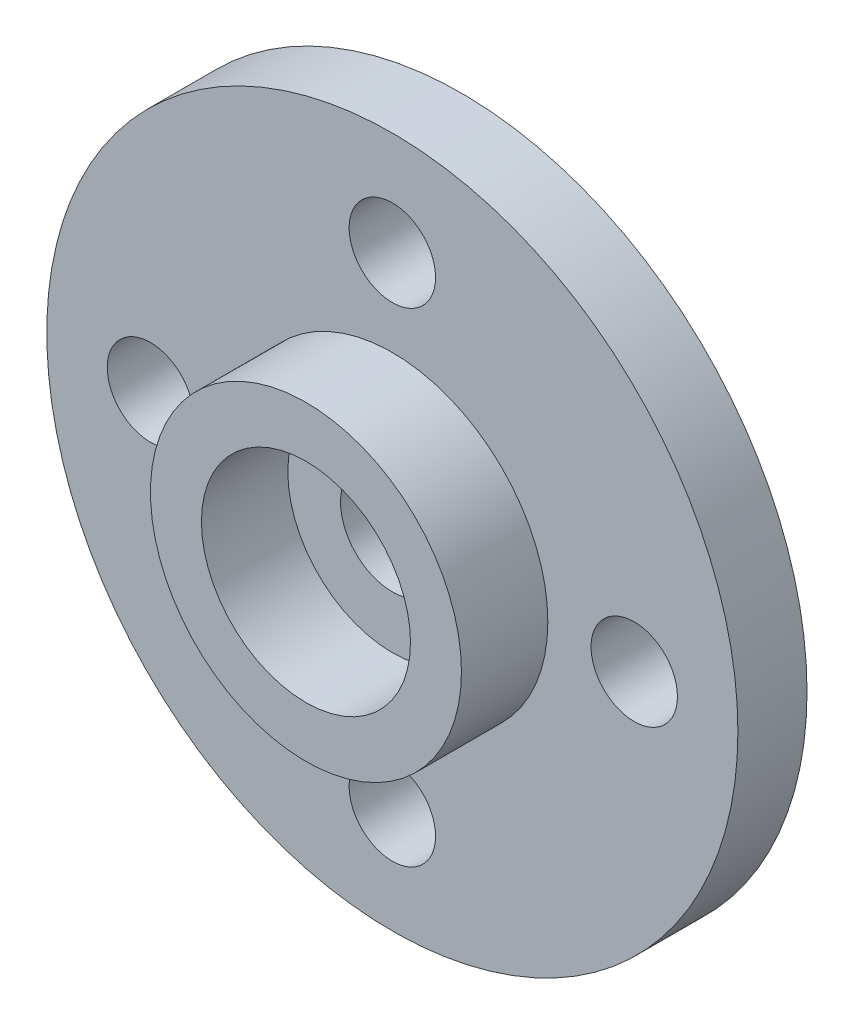
ISO-10303-21;
HEADER;
FILE_DESCRIPTION(('STEP AP214'),'2;1');
FILE_NAME('part.step','',(''),(''),'','','');
FILE_SCHEMA(('AUTOMOTIVE_DESIGN { 1 0 10303 214 1 1 1 1 }'));
ENDSEC;
DATA;
#1=APPLICATION_CONTEXT('core data for automotive mechanical design processes');
#2=APPLICATION_PROTOCOL_DEFINITION('international standard','automotive_design',2000,#1);
#3=PRODUCT_CONTEXT('',#1,'mechanical');
#4=PRODUCT('Part','Part','',(#3));
#5=PRODUCT_RELATED_PRODUCT_CATEGORY('part','',(#4));
#6=PRODUCT_DEFINITION_FORMATION('','',#4);
#7=PRODUCT_DEFINITION_CONTEXT('part definition',#1,'design');
#8=PRODUCT_DEFINITION('design','',#6,#7);
#9=PRODUCT_DEFINITION_SHAPE('','',#8);
#10=(LENGTH_UNIT() NAMED_UNIT(*) SI_UNIT(.MILLI.,.METRE.));
#11=(NAMED_UNIT(*) PLANE_ANGLE_UNIT() SI_UNIT($,.RADIAN.));
#12=(NAMED_UNIT(*) SI_UNIT($,.STERADIAN.) SOLID_ANGLE_UNIT());
#13=UNCERTAINTY_MEASURE_WITH_UNIT(LENGTH_MEASURE(1.E-05),#10,'distance_accuracy_value','');
#14=(GEOMETRIC_REPRESENTATION_CONTEXT(3) GLOBAL_UNCERTAINTY_ASSIGNED_CONTEXT((#13)) GLOBAL_UNIT_ASSIGNED_CONTEXT((#10,
#11,#12)) REPRESENTATION_CONTEXT('',''));
#15=CARTESIAN_POINT('',(0.,0.,0.));
#16=DIRECTION('',(0.,0.,1.));
#17=DIRECTION('',(1.,0.,0.));
#18=AXIS2_PLACEMENT_3D('',#15,#16,#17);
#19=CARTESIAN_POINT('',(0.,0.,2.));
#20=DIRECTION('',(0.,0.,1.));
#21=DIRECTION('',(1.,0.,0.));
#22=AXIS2_PLACEMENT_3D('',#19,#20,#21);
#23=PLANE('',#22);
#24=CARTESIAN_POINT('',(0.,0.,2.));
#25=DIRECTION('',(0.,0.,1.));
#26=DIRECTION('',(1.,0.,0.));
#27=AXIS2_PLACEMENT_3D('',#24,#25,#26);
#28=CIRCLE('',#27,1.5);
#29=CARTESIAN_POINT('',(1.5,0.,2.));
#30=VERTEX_POINT('',#29);
#31=EDGE_CURVE('E46',#30,#30,#28,.T.);
#32=ORIENTED_EDGE('',*,*,#31,.F.);
#33=EDGE_LOOP('',(#32));
#34=FACE_BOUND('',#33,.T.);
#35=CARTESIAN_POINT('',(0.,0.,2.));
#36=DIRECTION('',(0.,0.,1.));
#37=DIRECTION('',(1.,0.,0.));
#38=AXIS2_PLACEMENT_3D('',#35,#36,#37);
#39=CIRCLE('',#38,3.025);
#40=CARTESIAN_POINT('',(3.025,0.,2.));
#41=VERTEX_POINT('',#40);
#42=EDGE_CURVE('E10',#41,#41,#39,.F.);
#43=ORIENTED_EDGE('',*,*,#42,.F.);
#44=EDGE_LOOP('',(#43));
#45=FACE_BOUND('',#44,.T.);
#46=ADVANCED_FACE('F35',(#34,#45),#23,.T.);
#47=CARTESIAN_POINT('',(0.,0.,2.));
#48=DIRECTION('',(0.,0.,-1.));
#49=DIRECTION('',(-1.,0.,0.));
#50=AXIS2_PLACEMENT_3D('',#47,#48,#49);
#51=CYLINDRICAL_SURFACE('',#50,1.5);
#52=ORIENTED_EDGE('',*,*,#31,.T.);
#53=EDGE_LOOP('',(#52));
#54=FACE_BOUND('',#53,.T.);
#55=CARTESIAN_POINT('',(0.,0.,0.));
#56=DIRECTION('',(0.,0.,1.));
#57=DIRECTION('',(1.,0.,0.));
#58=AXIS2_PLACEMENT_3D('',#55,#56,#57);
#59=CIRCLE('',#58,1.5);
#60=CARTESIAN_POINT('',(1.5,0.,0.));
#61=VERTEX_POINT('',#60);
#62=EDGE_CURVE('E55',#61,#61,#59,.T.);
#63=ORIENTED_EDGE('',*,*,#62,.F.);
#64=EDGE_LOOP('',(#63));
#65=FACE_BOUND('',#64,.T.);
#66=ADVANCED_FACE('F37',(#54,#65),#51,.F.);
#67=CARTESIAN_POINT('',(0.,0.,2.));
#68=DIRECTION('',(0.,0.,-1.));
#69=DIRECTION('',(-1.,0.,0.));
#70=AXIS2_PLACEMENT_3D('',#67,#68,#69);
#71=CYLINDRICAL_SURFACE('',#70,10.);
#72=CARTESIAN_POINT('',(0.,0.,2.));
#73=DIRECTION('',(0.,0.,1.));
#74=DIRECTION('',(1.,0.,0.));
#75=AXIS2_PLACEMENT_3D('',#72,#73,#74);
#76=CIRCLE('',#75,10.);
#77=CARTESIAN_POINT('',(10.,0.,2.));
#78=VERTEX_POINT('',#77);
#79=EDGE_CURVE('E42',#78,#78,#76,.T.);
#80=ORIENTED_EDGE('',*,*,#79,.F.);
#81=EDGE_LOOP('',(#80));
#82=FACE_BOUND('',#81,.T.);
#83=CARTESIAN_POINT('',(0.,0.,0.));
#84=DIRECTION('',(0.,0.,1.));
#85=DIRECTION('',(1.,0.,0.));
#86=AXIS2_PLACEMENT_3D('',#83,#84,#85);
#87=CIRCLE('',#86,10.);
#88=CARTESIAN_POINT('',(10.,0.,0.));
#89=VERTEX_POINT('',#88);
#90=EDGE_CURVE('E51',#89,#89,#87,.T.);
#91=ORIENTED_EDGE('',*,*,#90,.T.);
#92=EDGE_LOOP('',(#91));
#93=FACE_BOUND('',#92,.T.);
#94=ADVANCED_FACE('F61',(#82,#93),#71,.T.);
#95=CARTESIAN_POINT('',(0.,0.,2.));
#96=DIRECTION('',(0.,0.,1.));
#97=DIRECTION('',(1.,0.,0.));
#98=AXIS2_PLACEMENT_3D('',#95,#96,#97);
#99=CIRCLE('',#98,4.5);
#100=CARTESIAN_POINT('',(4.5,0.,2.));
#101=VERTEX_POINT('',#100);
#102=EDGE_CURVE('E117',#101,#101,#99,.T.);
#103=ORIENTED_EDGE('',*,*,#102,.F.);
#104=EDGE_LOOP('',(#103));
#105=FACE_BOUND('',#104,.T.);
#106=CARTESIAN_POINT('',(7.,0.,2.));
#107=DIRECTION('',(0.,0.,1.));
#108=DIRECTION('',(1.,0.,0.));
#109=AXIS2_PLACEMENT_3D('',#106,#107,#108);
#110=CIRCLE('',#109,1.24999999999999);
#111=CARTESIAN_POINT('',(8.24999999999999,0.,2.));
#112=VERTEX_POINT('',#111);
#113=EDGE_CURVE('E124',#112,#112,#110,.T.);
#114=ORIENTED_EDGE('',*,*,#113,.F.);
#115=EDGE_LOOP('',(#114));
#116=FACE_BOUND('',#115,.T.);
#117=CARTESIAN_POINT('',(0.,-7.,2.));
#118=DIRECTION('',(0.,0.,1.));
#119=DIRECTION('',(1.,0.,0.));
#120=AXIS2_PLACEMENT_3D('',#117,#118,#119);
#121=CIRCLE('',#120,1.24999999999999);
#122=CARTESIAN_POINT('',(1.24999999999999,-7.,2.));
#123=VERTEX_POINT('',#122);
#124=EDGE_CURVE('E130',#123,#123,#121,.T.);
#125=ORIENTED_EDGE('',*,*,#124,.F.);
#126=EDGE_LOOP('',(#125));
#127=FACE_BOUND('',#126,.T.);
#128=CARTESIAN_POINT('',(-7.,0.,2.));
#129=DIRECTION('',(0.,0.,1.));
#130=DIRECTION('',(1.,0.,0.));
#131=AXIS2_PLACEMENT_3D('',#128,#129,#130);
#132=CIRCLE('',#131,1.24999999999999);
#133=CARTESIAN_POINT('',(-5.75000000000001,0.,2.));
#134=VERTEX_POINT('',#133);
#135=EDGE_CURVE('E136',#134,#134,#132,.T.);
#136=ORIENTED_EDGE('',*,*,#135,.F.);
#137=EDGE_LOOP('',(#136));
#138=FACE_BOUND('',#137,.T.);
#139=CARTESIAN_POINT('',(0.,7.,2.));
#140=DIRECTION('',(0.,0.,1.));
#141=DIRECTION('',(1.,0.,0.));
#142=AXIS2_PLACEMENT_3D('',#139,#140,#141);
#143=CIRCLE('',#142,1.24999999999999);
#144=CARTESIAN_POINT('',(1.24999999999999,7.,2.));
#145=VERTEX_POINT('',#144);
#146=EDGE_CURVE('E142',#145,#145,#143,.T.);
#147=ORIENTED_EDGE('',*,*,#146,.F.);
#148=EDGE_LOOP('',(#147));
#149=FACE_BOUND('',#148,.T.);
#150=ORIENTED_EDGE('',*,*,#79,.T.);
#151=EDGE_LOOP('',(#150));
#152=FACE_BOUND('',#151,.T.);
#153=ADVANCED_FACE('F66',(#105,#116,#127,#138,#149,#152),#23,.T.);
#154=CARTESIAN_POINT('',(0.,0.,0.));
#155=DIRECTION('',(0.,0.,1.));
#156=DIRECTION('',(1.,0.,0.));
#157=AXIS2_PLACEMENT_3D('',#154,#155,#156);
#158=PLANE('',#157);
#159=CARTESIAN_POINT('',(7.,0.,0.));
#160=DIRECTION('',(0.,0.,1.));
#161=DIRECTION('',(1.,0.,0.));
#162=AXIS2_PLACEMENT_3D('',#159,#160,#161);
#163=CIRCLE('',#162,1.25);
#164=CARTESIAN_POINT('',(8.25,0.,0.));
#165=VERTEX_POINT('',#164);
#166=EDGE_CURVE('E128',#165,#165,#163,.T.);
#167=ORIENTED_EDGE('',*,*,#166,.T.);
#168=EDGE_LOOP('',(#167));
#169=FACE_BOUND('',#168,.T.);
#170=CARTESIAN_POINT('',(0.,-7.,0.));
#171=DIRECTION('',(0.,0.,1.));
#172=DIRECTION('',(1.,0.,0.));
#173=AXIS2_PLACEMENT_3D('',#170,#171,#172);
#174=CIRCLE('',#173,1.25);
#175=CARTESIAN_POINT('',(1.25,-7.,0.));
#176=VERTEX_POINT('',#175);
#177=EDGE_CURVE('E133',#176,#176,#174,.T.);
#178=ORIENTED_EDGE('',*,*,#177,.T.);
#179=EDGE_LOOP('',(#178));
#180=FACE_BOUND('',#179,.T.);
#181=CARTESIAN_POINT('',(-7.,0.,0.));
#182=DIRECTION('',(0.,0.,1.));
#183=DIRECTION('',(1.,0.,0.));
#184=AXIS2_PLACEMENT_3D('',#181,#182,#183);
#185=CIRCLE('',#184,1.25);
#186=CARTESIAN_POINT('',(-5.75,0.,0.));
#187=VERTEX_POINT('',#186);
#188=EDGE_CURVE('E139',#187,#187,#185,.T.);
#189=ORIENTED_EDGE('',*,*,#188,.T.);
#190=EDGE_LOOP('',(#189));
#191=FACE_BOUND('',#190,.T.);
#192=CARTESIAN_POINT('',(0.,7.,0.));
#193=DIRECTION('',(0.,0.,1.));
#194=DIRECTION('',(1.,0.,0.));
#195=AXIS2_PLACEMENT_3D('',#192,#193,#194);
#196=CIRCLE('',#195,1.25);
#197=CARTESIAN_POINT('',(1.25,7.,0.));
#198=VERTEX_POINT('',#197);
#199=EDGE_CURVE('E57',#198,#198,#196,.T.);
#200=ORIENTED_EDGE('',*,*,#199,.T.);
#201=EDGE_LOOP('',(#200));
#202=FACE_BOUND('',#201,.T.);
#203=ORIENTED_EDGE('',*,*,#62,.T.);
#204=EDGE_LOOP('',(#203));
#205=FACE_BOUND('',#204,.T.);
#206=ORIENTED_EDGE('',*,*,#90,.F.);
#207=EDGE_LOOP('',(#206));
#208=FACE_BOUND('',#207,.T.);
#209=ADVANCED_FACE('F63',(#169,#180,#191,#202,#205,#208),#158,.F.);
#210=CARTESIAN_POINT('',(0.,7.,2.));
#211=DIRECTION('',(0.,0.,1.));
#212=DIRECTION('',(1.,0.,0.));
#213=AXIS2_PLACEMENT_3D('',#210,#211,#212);
#214=CYLINDRICAL_SURFACE('',#213,1.24999999999999);
#215=ORIENTED_EDGE('',*,*,#199,.F.);
#216=EDGE_LOOP('',(#215));
#217=FACE_BOUND('',#216,.T.);
#218=ORIENTED_EDGE('',*,*,#146,.T.);
#219=EDGE_LOOP('',(#218));
#220=FACE_BOUND('',#219,.T.);
#221=ADVANCED_FACE('F65',(#217,#220),#214,.F.);
#222=CARTESIAN_POINT('',(-7.,0.,2.));
#223=DIRECTION('',(0.,0.,1.));
#224=DIRECTION('',(1.,0.,0.));
#225=AXIS2_PLACEMENT_3D('',#222,#223,#224);
#226=CYLINDRICAL_SURFACE('',#225,1.24999999999999);
#227=ORIENTED_EDGE('',*,*,#188,.F.);
#228=EDGE_LOOP('',(#227));
#229=FACE_BOUND('',#228,.T.);
#230=ORIENTED_EDGE('',*,*,#135,.T.);
#231=EDGE_LOOP('',(#230));
#232=FACE_BOUND('',#231,.T.);
#233=ADVANCED_FACE('F73',(#229,#232),#226,.F.);
#234=CARTESIAN_POINT('',(0.,-7.,2.));
#235=DIRECTION('',(0.,0.,1.));
#236=DIRECTION('',(1.,0.,0.));
#237=AXIS2_PLACEMENT_3D('',#234,#235,#236);
#238=CYLINDRICAL_SURFACE('',#237,1.24999999999999);
#239=ORIENTED_EDGE('',*,*,#177,.F.);
#240=EDGE_LOOP('',(#239));
#241=FACE_BOUND('',#240,.T.);
#242=ORIENTED_EDGE('',*,*,#124,.T.);
#243=EDGE_LOOP('',(#242));
#244=FACE_BOUND('',#243,.T.);
#245=ADVANCED_FACE('F91',(#241,#244),#238,.F.);
#246=CARTESIAN_POINT('',(7.,0.,2.));
#247=DIRECTION('',(0.,0.,1.));
#248=DIRECTION('',(1.,0.,0.));
#249=AXIS2_PLACEMENT_3D('',#246,#247,#248);
#250=CYLINDRICAL_SURFACE('',#249,1.24999999999999);
#251=ORIENTED_EDGE('',*,*,#166,.F.);
#252=EDGE_LOOP('',(#251));
#253=FACE_BOUND('',#252,.T.);
#254=ORIENTED_EDGE('',*,*,#113,.T.);
#255=EDGE_LOOP('',(#254));
#256=FACE_BOUND('',#255,.T.);
#257=ADVANCED_FACE('F95',(#253,#256),#250,.F.);
#258=CARTESIAN_POINT('',(0.,0.,4.5));
#259=DIRECTION('',(0.,0.,1.));
#260=DIRECTION('',(1.,0.,0.));
#261=AXIS2_PLACEMENT_3D('',#258,#259,#260);
#262=PLANE('',#261);
#263=CARTESIAN_POINT('',(0.,0.,4.5));
#264=DIRECTION('',(0.,0.,1.));
#265=DIRECTION('',(1.,0.,0.));
#266=AXIS2_PLACEMENT_3D('',#263,#264,#265);
#267=CIRCLE('',#266,4.5);
#268=CARTESIAN_POINT('',(4.5,0.,4.5));
#269=VERTEX_POINT('',#268);
#270=EDGE_CURVE('E120',#269,#269,#267,.T.);
#271=ORIENTED_EDGE('',*,*,#270,.T.);
#272=EDGE_LOOP('',(#271));
#273=FACE_BOUND('',#272,.T.);
#274=CARTESIAN_POINT('',(0.,0.,4.5));
#275=DIRECTION('',(0.,0.,1.));
#276=DIRECTION('',(1.,0.,0.));
#277=AXIS2_PLACEMENT_3D('',#274,#275,#276);
#278=CIRCLE('',#277,3.025);
#279=CARTESIAN_POINT('',(3.025,0.,4.5));
#280=VERTEX_POINT('',#279);
#281=EDGE_CURVE('E115',#280,#280,#278,.T.);
#282=ORIENTED_EDGE('',*,*,#281,.F.);
#283=EDGE_LOOP('',(#282));
#284=FACE_BOUND('',#283,.T.);
#285=ADVANCED_FACE('F99',(#273,#284),#262,.T.);
#286=CARTESIAN_POINT('',(0.,0.,4.5));
#287=DIRECTION('',(0.,0.,-1.));
#288=DIRECTION('',(-1.,0.,0.));
#289=AXIS2_PLACEMENT_3D('',#286,#287,#288);
#290=CYLINDRICAL_SURFACE('',#289,4.5);
#291=ORIENTED_EDGE('',*,*,#270,.F.);
#292=EDGE_LOOP('',(#291));
#293=FACE_BOUND('',#292,.T.);
#294=ORIENTED_EDGE('',*,*,#102,.T.);
#295=EDGE_LOOP('',(#294));
#296=FACE_BOUND('',#295,.T.);
#297=ADVANCED_FACE('F101',(#293,#296),#290,.T.);
#298=CARTESIAN_POINT('',(0.,0.,4.5));
#299=DIRECTION('',(0.,0.,-1.));
#300=DIRECTION('',(-1.,0.,0.));
#301=AXIS2_PLACEMENT_3D('',#298,#299,#300);
#302=CYLINDRICAL_SURFACE('',#301,3.025);
#303=ORIENTED_EDGE('',*,*,#281,.T.);
#304=EDGE_LOOP('',(#303));
#305=FACE_BOUND('',#304,.T.);
#306=ORIENTED_EDGE('',*,*,#42,.T.);
#307=EDGE_LOOP('',(#306));
#308=FACE_BOUND('',#307,.T.);
#309=ADVANCED_FACE('F104',(#305,#308),#302,.F.);
#310=CLOSED_SHELL('',(#46,#66,#94,#153,#209,#221,#233,#245,#257,#285,#297,#309));
#311=MANIFOLD_SOLID_BREP('B2',#310);
#312=ADVANCED_BREP_SHAPE_REPRESENTATION('',(#18,#311),#14);
#313=SHAPE_DEFINITION_REPRESENTATION(#9,#312);
ENDSEC;
END-ISO-10303-21;
